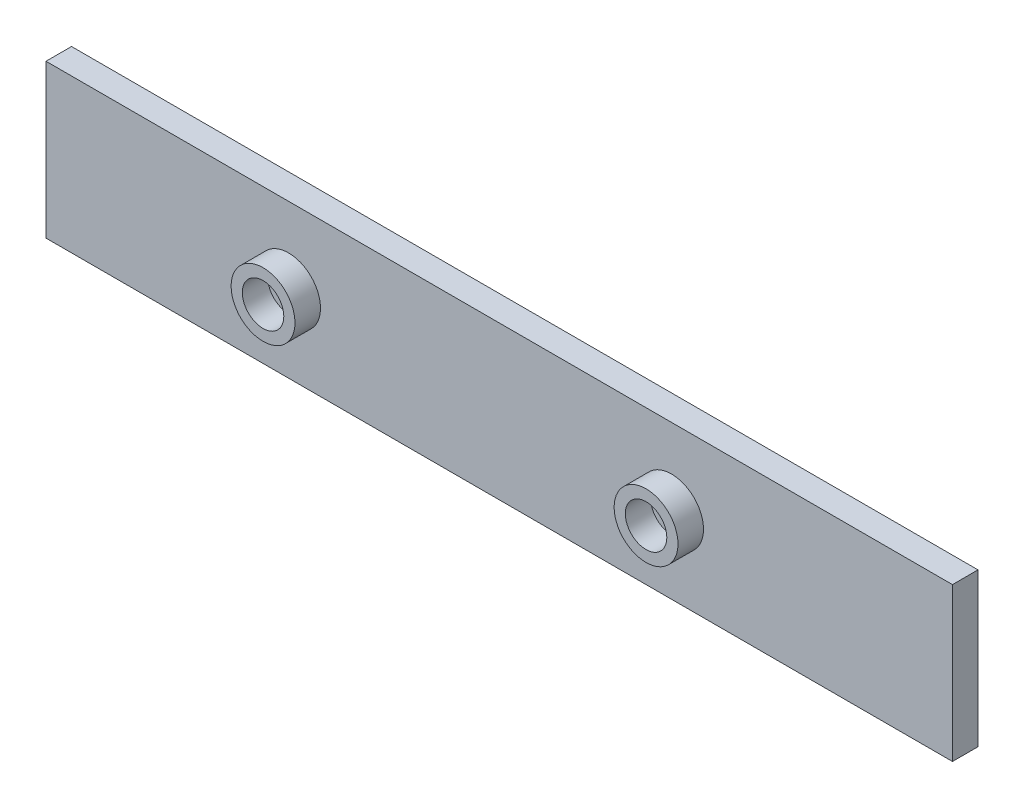
ISO-10303-21;
HEADER;
FILE_DESCRIPTION(('STEP AP214'),'2;1');
FILE_NAME('part.step','',(''),(''),'','','');
FILE_SCHEMA(('AUTOMOTIVE_DESIGN { 1 0 10303 214 1 1 1 1 }'));
ENDSEC;
DATA;
#1=APPLICATION_CONTEXT('core data for automotive mechanical design processes');
#2=APPLICATION_PROTOCOL_DEFINITION('international standard','automotive_design',2000,#1);
#3=PRODUCT_CONTEXT('',#1,'mechanical');
#4=PRODUCT('Part','Part','',(#3));
#5=PRODUCT_RELATED_PRODUCT_CATEGORY('part','',(#4));
#6=PRODUCT_DEFINITION_FORMATION('','',#4);
#7=PRODUCT_DEFINITION_CONTEXT('part definition',#1,'design');
#8=PRODUCT_DEFINITION('design','',#6,#7);
#9=PRODUCT_DEFINITION_SHAPE('','',#8);
#10=(LENGTH_UNIT() NAMED_UNIT(*) SI_UNIT(.MILLI.,.METRE.));
#11=(NAMED_UNIT(*) PLANE_ANGLE_UNIT() SI_UNIT($,.RADIAN.));
#12=(NAMED_UNIT(*) SI_UNIT($,.STERADIAN.) SOLID_ANGLE_UNIT());
#13=UNCERTAINTY_MEASURE_WITH_UNIT(LENGTH_MEASURE(1.E-05),#10,'distance_accuracy_value','');
#14=(GEOMETRIC_REPRESENTATION_CONTEXT(3) GLOBAL_UNCERTAINTY_ASSIGNED_CONTEXT((#13)) GLOBAL_UNIT_ASSIGNED_CONTEXT((#10,
#11,#12)) REPRESENTATION_CONTEXT('',''));
#15=CARTESIAN_POINT('',(0.,0.,0.));
#16=DIRECTION('',(0.,0.,1.));
#17=DIRECTION('',(1.,0.,0.));
#18=AXIS2_PLACEMENT_3D('',#15,#16,#17);
#19=CARTESIAN_POINT('',(0.,0.,2.));
#20=DIRECTION('',(1.,0.,0.));
#21=DIRECTION('',(0.,0.,-1.));
#22=AXIS2_PLACEMENT_3D('',#19,#20,#21);
#23=PLANE('',#22);
#24=DIRECTION('',(0.,-1.,0.));
#25=VECTOR('',#24,1.);
#26=CARTESIAN_POINT('',(0.,0.,0.));
#27=LINE('',#26,#25);
#28=CARTESIAN_POINT('',(0.,12.,0.));
#29=VERTEX_POINT('',#28);
#30=CARTESIAN_POINT('',(0.,0.,0.));
#31=VERTEX_POINT('',#30);
#32=EDGE_CURVE('E115',#29,#31,#27,.T.);
#33=ORIENTED_EDGE('',*,*,#32,.T.);
#34=DIRECTION('',(0.,0.,-1.));
#35=VECTOR('',#34,1.);
#36=CARTESIAN_POINT('',(0.,0.,2.));
#37=LINE('',#36,#35);
#38=CARTESIAN_POINT('',(0.,0.,2.));
#39=VERTEX_POINT('',#38);
#40=EDGE_CURVE('E104',#39,#31,#37,.T.);
#41=ORIENTED_EDGE('',*,*,#40,.F.);
#42=DIRECTION('',(0.,-1.,0.));
#43=VECTOR('',#42,1.);
#44=CARTESIAN_POINT('',(0.,0.,2.));
#45=LINE('',#44,#43);
#46=CARTESIAN_POINT('',(0.,12.,2.));
#47=VERTEX_POINT('',#46);
#48=EDGE_CURVE('E96',#47,#39,#45,.T.);
#49=ORIENTED_EDGE('',*,*,#48,.F.);
#50=DIRECTION('',(0.,0.,-1.));
#51=VECTOR('',#50,1.);
#52=CARTESIAN_POINT('',(0.,12.,2.));
#53=LINE('',#52,#51);
#54=EDGE_CURVE('E111',#47,#29,#53,.T.);
#55=ORIENTED_EDGE('',*,*,#54,.T.);
#56=EDGE_LOOP('',(#33,#41,#49,#55));
#57=FACE_BOUND('',#56,.T.);
#58=ADVANCED_FACE('F43',(#57),#23,.F.);
#59=CARTESIAN_POINT('',(0.,0.,2.));
#60=DIRECTION('',(0.,1.,0.));
#61=DIRECTION('',(0.,0.,1.));
#62=AXIS2_PLACEMENT_3D('',#59,#60,#61);
#63=PLANE('',#62);
#64=DIRECTION('',(1.,0.,0.));
#65=VECTOR('',#64,1.);
#66=CARTESIAN_POINT('',(0.,0.,0.));
#67=LINE('',#66,#65);
#68=CARTESIAN_POINT('',(71.,0.,0.));
#69=VERTEX_POINT('',#68);
#70=EDGE_CURVE('E102',#31,#69,#67,.T.);
#71=ORIENTED_EDGE('',*,*,#70,.T.);
#72=DIRECTION('',(0.,0.,-1.));
#73=VECTOR('',#72,1.);
#74=CARTESIAN_POINT('',(71.,0.,2.));
#75=LINE('',#74,#73);
#76=CARTESIAN_POINT('',(71.,0.,2.));
#77=VERTEX_POINT('',#76);
#78=EDGE_CURVE('E100',#77,#69,#75,.T.);
#79=ORIENTED_EDGE('',*,*,#78,.F.);
#80=DIRECTION('',(1.,0.,0.));
#81=VECTOR('',#80,1.);
#82=CARTESIAN_POINT('',(0.,0.,2.));
#83=LINE('',#82,#81);
#84=EDGE_CURVE('E91',#39,#77,#83,.T.);
#85=ORIENTED_EDGE('',*,*,#84,.F.);
#86=ORIENTED_EDGE('',*,*,#40,.T.);
#87=EDGE_LOOP('',(#71,#79,#85,#86));
#88=FACE_BOUND('',#87,.T.);
#89=ADVANCED_FACE('F101',(#88),#63,.F.);
#90=CARTESIAN_POINT('',(71.,0.,2.));
#91=DIRECTION('',(-1.,0.,0.));
#92=DIRECTION('',(0.,0.,1.));
#93=AXIS2_PLACEMENT_3D('',#90,#91,#92);
#94=PLANE('',#93);
#95=DIRECTION('',(0.,1.,0.));
#96=VECTOR('',#95,1.);
#97=CARTESIAN_POINT('',(71.,0.,0.));
#98=LINE('',#97,#96);
#99=CARTESIAN_POINT('',(71.,12.,0.));
#100=VERTEX_POINT('',#99);
#101=EDGE_CURVE('E77',#69,#100,#98,.T.);
#102=ORIENTED_EDGE('',*,*,#101,.T.);
#103=DIRECTION('',(0.,0.,-1.));
#104=VECTOR('',#103,1.);
#105=CARTESIAN_POINT('',(71.,12.,2.));
#106=LINE('',#105,#104);
#107=CARTESIAN_POINT('',(71.,12.,2.));
#108=VERTEX_POINT('',#107);
#109=EDGE_CURVE('E105',#108,#100,#106,.T.);
#110=ORIENTED_EDGE('',*,*,#109,.F.);
#111=DIRECTION('',(0.,1.,0.));
#112=VECTOR('',#111,1.);
#113=CARTESIAN_POINT('',(71.,0.,2.));
#114=LINE('',#113,#112);
#115=EDGE_CURVE('E94',#77,#108,#114,.T.);
#116=ORIENTED_EDGE('',*,*,#115,.F.);
#117=ORIENTED_EDGE('',*,*,#78,.T.);
#118=EDGE_LOOP('',(#102,#110,#116,#117));
#119=FACE_BOUND('',#118,.T.);
#120=ADVANCED_FACE('F107',(#119),#94,.F.);
#121=CARTESIAN_POINT('',(0.,12.,2.));
#122=DIRECTION('',(0.,-1.,0.));
#123=DIRECTION('',(0.,0.,-1.));
#124=AXIS2_PLACEMENT_3D('',#121,#122,#123);
#125=PLANE('',#124);
#126=DIRECTION('',(-1.,0.,0.));
#127=VECTOR('',#126,1.);
#128=CARTESIAN_POINT('',(0.,12.,0.));
#129=LINE('',#128,#127);
#130=EDGE_CURVE('E83',#100,#29,#129,.T.);
#131=ORIENTED_EDGE('',*,*,#130,.T.);
#132=ORIENTED_EDGE('',*,*,#54,.F.);
#133=DIRECTION('',(-1.,0.,0.));
#134=VECTOR('',#133,1.);
#135=CARTESIAN_POINT('',(0.,12.,2.));
#136=LINE('',#135,#134);
#137=EDGE_CURVE('E60',#108,#47,#136,.T.);
#138=ORIENTED_EDGE('',*,*,#137,.F.);
#139=ORIENTED_EDGE('',*,*,#109,.T.);
#140=EDGE_LOOP('',(#131,#132,#138,#139));
#141=FACE_BOUND('',#140,.T.);
#142=ADVANCED_FACE('F139',(#141),#125,.F.);
#143=CARTESIAN_POINT('',(0.,0.,2.));
#144=DIRECTION('',(0.,0.,-1.));
#145=DIRECTION('',(-1.,0.,0.));
#146=AXIS2_PLACEMENT_3D('',#143,#144,#145);
#147=PLANE('',#146);
#148=CARTESIAN_POINT('',(19.,6.,2.));
#149=DIRECTION('',(0.,0.,-1.));
#150=DIRECTION('',(-1.,0.,0.));
#151=AXIS2_PLACEMENT_3D('',#148,#149,#150);
#152=CIRCLE('',#151,2.5);
#153=CARTESIAN_POINT('',(16.5,6.,2.));
#154=VERTEX_POINT('',#153);
#155=EDGE_CURVE('E11',#154,#154,#152,.F.);
#156=ORIENTED_EDGE('',*,*,#155,.F.);
#157=EDGE_LOOP('',(#156));
#158=FACE_BOUND('',#157,.T.);
#159=CARTESIAN_POINT('',(49.,6.,2.));
#160=DIRECTION('',(0.,0.,-1.));
#161=DIRECTION('',(-1.,0.,0.));
#162=AXIS2_PLACEMENT_3D('',#159,#160,#161);
#163=CIRCLE('',#162,2.5);
#164=CARTESIAN_POINT('',(46.5,6.,2.));
#165=VERTEX_POINT('',#164);
#166=EDGE_CURVE('E52',#165,#165,#163,.F.);
#167=ORIENTED_EDGE('',*,*,#166,.F.);
#168=EDGE_LOOP('',(#167));
#169=FACE_BOUND('',#168,.T.);
#170=ORIENTED_EDGE('',*,*,#48,.T.);
#171=ORIENTED_EDGE('',*,*,#84,.T.);
#172=ORIENTED_EDGE('',*,*,#115,.T.);
#173=ORIENTED_EDGE('',*,*,#137,.T.);
#174=EDGE_LOOP('',(#170,#171,#172,#173));
#175=FACE_BOUND('',#174,.T.);
#176=ADVANCED_FACE('F92',(#158,#169,#175),#147,.F.);
#177=CARTESIAN_POINT('',(0.,0.,0.));
#178=DIRECTION('',(0.,0.,-1.));
#179=DIRECTION('',(-1.,0.,0.));
#180=AXIS2_PLACEMENT_3D('',#177,#178,#179);
#181=PLANE('',#180);
#182=ORIENTED_EDGE('',*,*,#32,.F.);
#183=ORIENTED_EDGE('',*,*,#130,.F.);
#184=ORIENTED_EDGE('',*,*,#101,.F.);
#185=ORIENTED_EDGE('',*,*,#70,.F.);
#186=EDGE_LOOP('',(#182,#183,#184,#185));
#187=FACE_BOUND('',#186,.T.);
#188=ADVANCED_FACE('F138',(#187),#181,.T.);
#189=CARTESIAN_POINT('',(49.,6.,4.));
#190=DIRECTION('',(0.,0.,1.));
#191=DIRECTION('',(1.,0.,0.));
#192=AXIS2_PLACEMENT_3D('',#189,#190,#191);
#193=PLANE('',#192);
#194=CARTESIAN_POINT('',(49.,6.,4.));
#195=DIRECTION('',(0.,0.,1.));
#196=DIRECTION('',(1.,0.,0.));
#197=AXIS2_PLACEMENT_3D('',#194,#195,#196);
#198=CIRCLE('',#197,2.5);
#199=CARTESIAN_POINT('',(51.5,6.,4.));
#200=VERTEX_POINT('',#199);
#201=EDGE_CURVE('E119',#200,#200,#198,.T.);
#202=ORIENTED_EDGE('',*,*,#201,.T.);
#203=EDGE_LOOP('',(#202));
#204=FACE_BOUND('',#203,.T.);
#205=CARTESIAN_POINT('',(49.,6.,4.));
#206=DIRECTION('',(0.,0.,1.));
#207=DIRECTION('',(1.,0.,0.));
#208=AXIS2_PLACEMENT_3D('',#205,#206,#207);
#209=CIRCLE('',#208,1.625);
#210=CARTESIAN_POINT('',(50.625,6.,4.));
#211=VERTEX_POINT('',#210);
#212=EDGE_CURVE('E172',#211,#211,#209,.T.);
#213=ORIENTED_EDGE('',*,*,#212,.F.);
#214=EDGE_LOOP('',(#213));
#215=FACE_BOUND('',#214,.T.);
#216=ADVANCED_FACE('F148',(#204,#215),#193,.T.);
#217=CARTESIAN_POINT('',(49.,6.,4.));
#218=DIRECTION('',(0.,0.,-1.));
#219=DIRECTION('',(-1.,0.,0.));
#220=AXIS2_PLACEMENT_3D('',#217,#218,#219);
#221=CYLINDRICAL_SURFACE('',#220,2.5);
#222=ORIENTED_EDGE('',*,*,#201,.F.);
#223=EDGE_LOOP('',(#222));
#224=FACE_BOUND('',#223,.T.);
#225=ORIENTED_EDGE('',*,*,#166,.T.);
#226=EDGE_LOOP('',(#225));
#227=FACE_BOUND('',#226,.T.);
#228=ADVANCED_FACE('F135',(#224,#227),#221,.T.);
#229=CARTESIAN_POINT('',(49.,6.,4.));
#230=DIRECTION('',(0.,0.,-1.));
#231=DIRECTION('',(-1.,0.,0.));
#232=AXIS2_PLACEMENT_3D('',#229,#230,#231);
#233=CYLINDRICAL_SURFACE('',#232,1.625);
#234=ORIENTED_EDGE('',*,*,#212,.T.);
#235=EDGE_LOOP('',(#234));
#236=FACE_BOUND('',#235,.T.);
#237=CARTESIAN_POINT('',(49.,6.,2.));
#238=DIRECTION('',(0.,0.,1.));
#239=DIRECTION('',(1.,0.,0.));
#240=AXIS2_PLACEMENT_3D('',#237,#238,#239);
#241=CIRCLE('',#240,1.625);
#242=CARTESIAN_POINT('',(50.625,6.,2.));
#243=VERTEX_POINT('',#242);
#244=EDGE_CURVE('E173',#243,#243,#241,.T.);
#245=ORIENTED_EDGE('',*,*,#244,.F.);
#246=EDGE_LOOP('',(#245));
#247=FACE_BOUND('',#246,.T.);
#248=ADVANCED_FACE('F159',(#236,#247),#233,.F.);
#249=ORIENTED_EDGE('',*,*,#244,.T.);
#250=EDGE_LOOP('',(#249));
#251=FACE_BOUND('',#250,.T.);
#252=ADVANCED_FACE('F143',(#251),#147,.F.);
#253=CARTESIAN_POINT('',(19.,6.,4.));
#254=DIRECTION('',(0.,0.,1.));
#255=DIRECTION('',(1.,0.,0.));
#256=AXIS2_PLACEMENT_3D('',#253,#254,#255);
#257=PLANE('',#256);
#258=CARTESIAN_POINT('',(19.,6.,4.));
#259=DIRECTION('',(0.,0.,1.));
#260=DIRECTION('',(1.,0.,0.));
#261=AXIS2_PLACEMENT_3D('',#258,#259,#260);
#262=CIRCLE('',#261,2.5);
#263=CARTESIAN_POINT('',(21.5,6.,4.));
#264=VERTEX_POINT('',#263);
#265=EDGE_CURVE('E185',#264,#264,#262,.T.);
#266=ORIENTED_EDGE('',*,*,#265,.T.);
#267=EDGE_LOOP('',(#266));
#268=FACE_BOUND('',#267,.T.);
#269=CARTESIAN_POINT('',(19.,6.,4.));
#270=DIRECTION('',(0.,0.,1.));
#271=DIRECTION('',(1.,0.,0.));
#272=AXIS2_PLACEMENT_3D('',#269,#270,#271);
#273=CIRCLE('',#272,1.625);
#274=CARTESIAN_POINT('',(20.625,6.,4.));
#275=VERTEX_POINT('',#274);
#276=EDGE_CURVE('E181',#275,#275,#273,.T.);
#277=ORIENTED_EDGE('',*,*,#276,.F.);
#278=EDGE_LOOP('',(#277));
#279=FACE_BOUND('',#278,.T.);
#280=ADVANCED_FACE('F158',(#268,#279),#257,.T.);
#281=CARTESIAN_POINT('',(19.,6.,4.));
#282=DIRECTION('',(0.,0.,-1.));
#283=DIRECTION('',(-1.,0.,0.));
#284=AXIS2_PLACEMENT_3D('',#281,#282,#283);
#285=CYLINDRICAL_SURFACE('',#284,2.5);
#286=ORIENTED_EDGE('',*,*,#265,.F.);
#287=EDGE_LOOP('',(#286));
#288=FACE_BOUND('',#287,.T.);
#289=ORIENTED_EDGE('',*,*,#155,.T.);
#290=EDGE_LOOP('',(#289));
#291=FACE_BOUND('',#290,.T.);
#292=ADVANCED_FACE('F195',(#288,#291),#285,.T.);
#293=CARTESIAN_POINT('',(19.,6.,4.));
#294=DIRECTION('',(0.,0.,-1.));
#295=DIRECTION('',(-1.,0.,0.));
#296=AXIS2_PLACEMENT_3D('',#293,#294,#295);
#297=CYLINDRICAL_SURFACE('',#296,1.625);
#298=ORIENTED_EDGE('',*,*,#276,.T.);
#299=EDGE_LOOP('',(#298));
#300=FACE_BOUND('',#299,.T.);
#301=CARTESIAN_POINT('',(19.,6.,2.));
#302=DIRECTION('',(0.,0.,1.));
#303=DIRECTION('',(1.,0.,0.));
#304=AXIS2_PLACEMENT_3D('',#301,#302,#303);
#305=CIRCLE('',#304,1.625);
#306=CARTESIAN_POINT('',(20.625,6.,2.));
#307=VERTEX_POINT('',#306);
#308=EDGE_CURVE('E177',#307,#307,#305,.T.);
#309=ORIENTED_EDGE('',*,*,#308,.F.);
#310=EDGE_LOOP('',(#309));
#311=FACE_BOUND('',#310,.T.);
#312=ADVANCED_FACE('F155',(#300,#311),#297,.F.);
#313=ORIENTED_EDGE('',*,*,#308,.T.);
#314=EDGE_LOOP('',(#313));
#315=FACE_BOUND('',#314,.T.);
#316=ADVANCED_FACE('F142',(#315),#147,.F.);
#317=CLOSED_SHELL('',(#58,#89,#120,#142,#176,#188,#216,#228,#248,#252,#280,#292,#312,#316));
#318=MANIFOLD_SOLID_BREP('B2',#317);
#319=ADVANCED_BREP_SHAPE_REPRESENTATION('',(#18,#318),#14);
#320=SHAPE_DEFINITION_REPRESENTATION(#9,#319);
ENDSEC;
END-ISO-10303-21;
